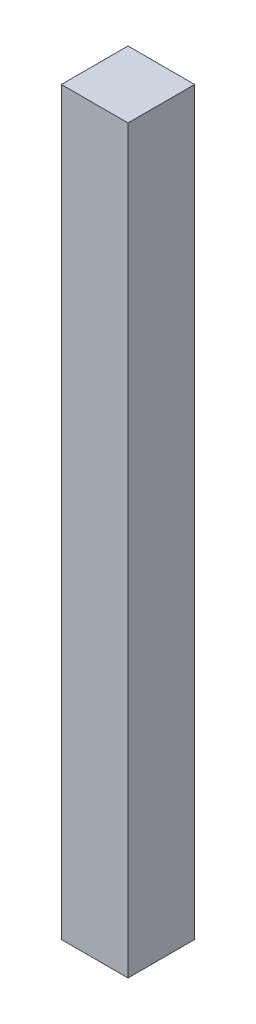
ISO-10303-21;
HEADER;
FILE_DESCRIPTION(('STEP AP214'),'2;1');
FILE_NAME('part.step','',(''),(''),'','','');
FILE_SCHEMA(('AUTOMOTIVE_DESIGN { 1 0 10303 214 1 1 1 1 }'));
ENDSEC;
DATA;
#1=APPLICATION_CONTEXT('core data for automotive mechanical design processes');
#2=APPLICATION_PROTOCOL_DEFINITION('international standard','automotive_design',2000,#1);
#3=PRODUCT_CONTEXT('',#1,'mechanical');
#4=PRODUCT('Part','Part','',(#3));
#5=PRODUCT_RELATED_PRODUCT_CATEGORY('part','',(#4));
#6=PRODUCT_DEFINITION_FORMATION('','',#4);
#7=PRODUCT_DEFINITION_CONTEXT('part definition',#1,'design');
#8=PRODUCT_DEFINITION('design','',#6,#7);
#9=PRODUCT_DEFINITION_SHAPE('','',#8);
#10=(LENGTH_UNIT() NAMED_UNIT(*) SI_UNIT(.MILLI.,.METRE.));
#11=(NAMED_UNIT(*) PLANE_ANGLE_UNIT() SI_UNIT($,.RADIAN.));
#12=(NAMED_UNIT(*) SI_UNIT($,.STERADIAN.) SOLID_ANGLE_UNIT());
#13=UNCERTAINTY_MEASURE_WITH_UNIT(LENGTH_MEASURE(1.E-05),#10,'distance_accuracy_value','');
#14=(GEOMETRIC_REPRESENTATION_CONTEXT(3) GLOBAL_UNCERTAINTY_ASSIGNED_CONTEXT((#13)) GLOBAL_UNIT_ASSIGNED_CONTEXT((#10,
#11,#12)) REPRESENTATION_CONTEXT('',''));
#15=CARTESIAN_POINT('',(0.,0.,0.));
#16=DIRECTION('',(0.,0.,1.));
#17=DIRECTION('',(1.,0.,0.));
#18=AXIS2_PLACEMENT_3D('',#15,#16,#17);
#19=CARTESIAN_POINT('',(637.,490.,26.));
#20=DIRECTION('',(1.,0.,0.));
#21=DIRECTION('',(0.,0.,-1.));
#22=AXIS2_PLACEMENT_3D('',#19,#20,#21);
#23=PLANE('',#22);
#24=DIRECTION('',(0.,-1.,0.));
#25=VECTOR('',#24,1.);
#26=CARTESIAN_POINT('',(637.,490.,8.));
#27=LINE('',#26,#25);
#28=CARTESIAN_POINT('',(637.,690.,8.));
#29=VERTEX_POINT('',#28);
#30=CARTESIAN_POINT('',(637.,490.,8.));
#31=VERTEX_POINT('',#30);
#32=EDGE_CURVE('E102',#29,#31,#27,.T.);
#33=ORIENTED_EDGE('',*,*,#32,.T.);
#34=DIRECTION('',(0.,0.,-1.));
#35=VECTOR('',#34,1.);
#36=CARTESIAN_POINT('',(637.,490.,26.));
#37=LINE('',#36,#35);
#38=CARTESIAN_POINT('',(637.,490.,26.));
#39=VERTEX_POINT('',#38);
#40=EDGE_CURVE('E11',#39,#31,#37,.T.);
#41=ORIENTED_EDGE('',*,*,#40,.F.);
#42=DIRECTION('',(0.,-1.,0.));
#43=VECTOR('',#42,1.);
#44=CARTESIAN_POINT('',(637.,490.,26.));
#45=LINE('',#44,#43);
#46=CARTESIAN_POINT('',(637.,690.,26.));
#47=VERTEX_POINT('',#46);
#48=EDGE_CURVE('E90',#47,#39,#45,.T.);
#49=ORIENTED_EDGE('',*,*,#48,.F.);
#50=DIRECTION('',(0.,0.,-1.));
#51=VECTOR('',#50,1.);
#52=CARTESIAN_POINT('',(637.,690.,26.));
#53=LINE('',#52,#51);
#54=EDGE_CURVE('E98',#47,#29,#53,.T.);
#55=ORIENTED_EDGE('',*,*,#54,.T.);
#56=EDGE_LOOP('',(#33,#41,#49,#55));
#57=FACE_BOUND('',#56,.T.);
#58=ADVANCED_FACE('F39',(#57),#23,.F.);
#59=CARTESIAN_POINT('',(637.,490.,26.));
#60=DIRECTION('',(0.,1.,0.));
#61=DIRECTION('',(0.,0.,1.));
#62=AXIS2_PLACEMENT_3D('',#59,#60,#61);
#63=PLANE('',#62);
#64=DIRECTION('',(1.,0.,0.));
#65=VECTOR('',#64,1.);
#66=CARTESIAN_POINT('',(637.,490.,8.));
#67=LINE('',#66,#65);
#68=CARTESIAN_POINT('',(655.,490.,8.));
#69=VERTEX_POINT('',#68);
#70=EDGE_CURVE('E94',#31,#69,#67,.T.);
#71=ORIENTED_EDGE('',*,*,#70,.T.);
#72=DIRECTION('',(0.,0.,-1.));
#73=VECTOR('',#72,1.);
#74=CARTESIAN_POINT('',(655.,490.,26.));
#75=LINE('',#74,#73);
#76=CARTESIAN_POINT('',(655.,490.,26.));
#77=VERTEX_POINT('',#76);
#78=EDGE_CURVE('E47',#77,#69,#75,.T.);
#79=ORIENTED_EDGE('',*,*,#78,.F.);
#80=DIRECTION('',(1.,0.,0.));
#81=VECTOR('',#80,1.);
#82=CARTESIAN_POINT('',(637.,490.,26.));
#83=LINE('',#82,#81);
#84=EDGE_CURVE('E85',#39,#77,#83,.T.);
#85=ORIENTED_EDGE('',*,*,#84,.F.);
#86=ORIENTED_EDGE('',*,*,#40,.T.);
#87=EDGE_LOOP('',(#71,#79,#85,#86));
#88=FACE_BOUND('',#87,.T.);
#89=ADVANCED_FACE('F93',(#88),#63,.F.);
#90=CARTESIAN_POINT('',(655.,490.,26.));
#91=DIRECTION('',(-1.,0.,0.));
#92=DIRECTION('',(0.,0.,1.));
#93=AXIS2_PLACEMENT_3D('',#90,#91,#92);
#94=PLANE('',#93);
#95=DIRECTION('',(0.,1.,0.));
#96=VECTOR('',#95,1.);
#97=CARTESIAN_POINT('',(655.,490.,8.));
#98=LINE('',#97,#96);
#99=CARTESIAN_POINT('',(655.,690.,8.));
#100=VERTEX_POINT('',#99);
#101=EDGE_CURVE('E72',#69,#100,#98,.T.);
#102=ORIENTED_EDGE('',*,*,#101,.T.);
#103=DIRECTION('',(0.,0.,-1.));
#104=VECTOR('',#103,1.);
#105=CARTESIAN_POINT('',(655.,690.,26.));
#106=LINE('',#105,#104);
#107=CARTESIAN_POINT('',(655.,690.,26.));
#108=VERTEX_POINT('',#107);
#109=EDGE_CURVE('E95',#108,#100,#106,.T.);
#110=ORIENTED_EDGE('',*,*,#109,.F.);
#111=DIRECTION('',(0.,1.,0.));
#112=VECTOR('',#111,1.);
#113=CARTESIAN_POINT('',(655.,490.,26.));
#114=LINE('',#113,#112);
#115=EDGE_CURVE('E88',#77,#108,#114,.T.);
#116=ORIENTED_EDGE('',*,*,#115,.F.);
#117=ORIENTED_EDGE('',*,*,#78,.T.);
#118=EDGE_LOOP('',(#102,#110,#116,#117));
#119=FACE_BOUND('',#118,.T.);
#120=ADVANCED_FACE('F96',(#119),#94,.F.);
#121=CARTESIAN_POINT('',(637.,690.,26.));
#122=DIRECTION('',(0.,-1.,0.));
#123=DIRECTION('',(0.,0.,-1.));
#124=AXIS2_PLACEMENT_3D('',#121,#122,#123);
#125=PLANE('',#124);
#126=DIRECTION('',(-1.,0.,0.));
#127=VECTOR('',#126,1.);
#128=CARTESIAN_POINT('',(637.,690.,8.));
#129=LINE('',#128,#127);
#130=EDGE_CURVE('E78',#100,#29,#129,.T.);
#131=ORIENTED_EDGE('',*,*,#130,.T.);
#132=ORIENTED_EDGE('',*,*,#54,.F.);
#133=DIRECTION('',(-1.,0.,0.));
#134=VECTOR('',#133,1.);
#135=CARTESIAN_POINT('',(637.,690.,26.));
#136=LINE('',#135,#134);
#137=EDGE_CURVE('E55',#108,#47,#136,.T.);
#138=ORIENTED_EDGE('',*,*,#137,.F.);
#139=ORIENTED_EDGE('',*,*,#109,.T.);
#140=EDGE_LOOP('',(#131,#132,#138,#139));
#141=FACE_BOUND('',#140,.T.);
#142=ADVANCED_FACE('F109',(#141),#125,.F.);
#143=CARTESIAN_POINT('',(0.,0.,26.));
#144=DIRECTION('',(0.,0.,-1.));
#145=DIRECTION('',(-1.,0.,0.));
#146=AXIS2_PLACEMENT_3D('',#143,#144,#145);
#147=PLANE('',#146);
#148=ORIENTED_EDGE('',*,*,#48,.T.);
#149=ORIENTED_EDGE('',*,*,#84,.T.);
#150=ORIENTED_EDGE('',*,*,#115,.T.);
#151=ORIENTED_EDGE('',*,*,#137,.T.);
#152=EDGE_LOOP('',(#148,#149,#150,#151));
#153=FACE_BOUND('',#152,.T.);
#154=ADVANCED_FACE('F86',(#153),#147,.F.);
#155=CARTESIAN_POINT('',(0.,0.,8.));
#156=DIRECTION('',(0.,0.,-1.));
#157=DIRECTION('',(-1.,0.,0.));
#158=AXIS2_PLACEMENT_3D('',#155,#156,#157);
#159=PLANE('',#158);
#160=ORIENTED_EDGE('',*,*,#32,.F.);
#161=ORIENTED_EDGE('',*,*,#130,.F.);
#162=ORIENTED_EDGE('',*,*,#101,.F.);
#163=ORIENTED_EDGE('',*,*,#70,.F.);
#164=EDGE_LOOP('',(#160,#161,#162,#163));
#165=FACE_BOUND('',#164,.T.);
#166=ADVANCED_FACE('F112',(#165),#159,.T.);
#167=CLOSED_SHELL('',(#58,#89,#120,#142,#154,#166));
#168=MANIFOLD_SOLID_BREP('B2',#167);
#169=ADVANCED_BREP_SHAPE_REPRESENTATION('',(#18,#168),#14);
#170=SHAPE_DEFINITION_REPRESENTATION(#9,#169);
ENDSEC;
END-ISO-10303-21;
